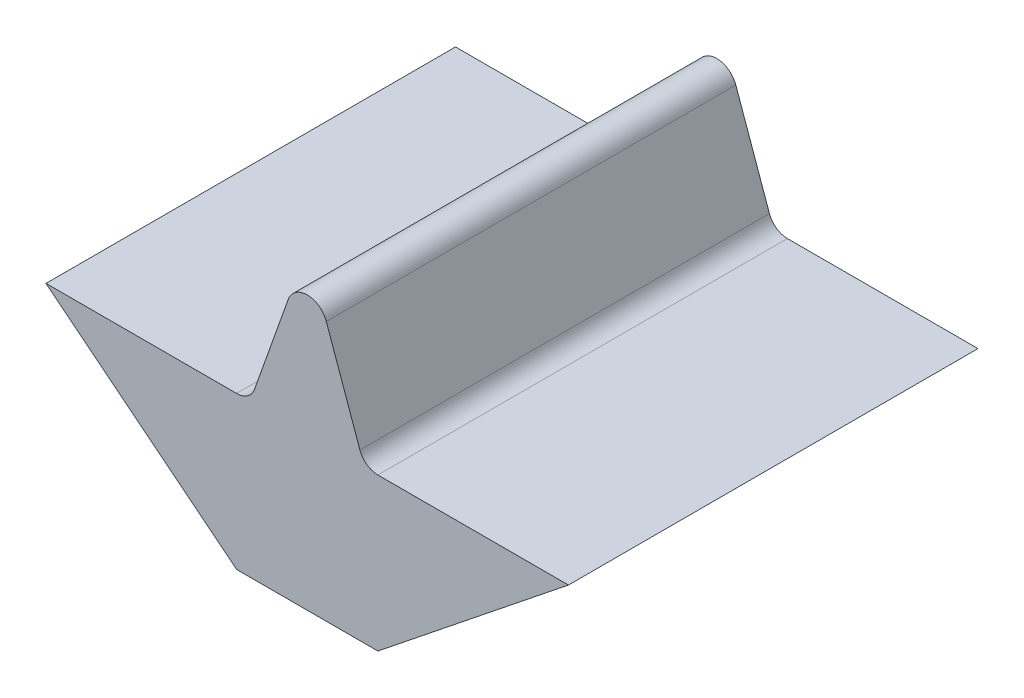
ISO-10303-21;
HEADER;
FILE_DESCRIPTION(('STEP AP214'),'2;1');
FILE_NAME('part.step','',(''),(''),'','','');
FILE_SCHEMA(('AUTOMOTIVE_DESIGN { 1 0 10303 214 1 1 1 1 }'));
ENDSEC;
DATA;
#1=APPLICATION_CONTEXT('core data for automotive mechanical design processes');
#2=APPLICATION_PROTOCOL_DEFINITION('international standard','automotive_design',2000,#1);
#3=PRODUCT_CONTEXT('',#1,'mechanical');
#4=PRODUCT('Part','Part','',(#3));
#5=PRODUCT_RELATED_PRODUCT_CATEGORY('part','',(#4));
#6=PRODUCT_DEFINITION_FORMATION('','',#4);
#7=PRODUCT_DEFINITION_CONTEXT('part definition',#1,'design');
#8=PRODUCT_DEFINITION('design','',#6,#7);
#9=PRODUCT_DEFINITION_SHAPE('','',#8);
#10=(LENGTH_UNIT() NAMED_UNIT(*) SI_UNIT(.MILLI.,.METRE.));
#11=(NAMED_UNIT(*) PLANE_ANGLE_UNIT() SI_UNIT($,.RADIAN.));
#12=(NAMED_UNIT(*) SI_UNIT($,.STERADIAN.) SOLID_ANGLE_UNIT());
#13=UNCERTAINTY_MEASURE_WITH_UNIT(LENGTH_MEASURE(1.E-05),#10,'distance_accuracy_value','');
#14=(GEOMETRIC_REPRESENTATION_CONTEXT(3) GLOBAL_UNCERTAINTY_ASSIGNED_CONTEXT((#13)) GLOBAL_UNIT_ASSIGNED_CONTEXT((#10,
#11,#12)) REPRESENTATION_CONTEXT('',''));
#15=CARTESIAN_POINT('',(0.,0.,0.));
#16=DIRECTION('',(0.,0.,1.));
#17=DIRECTION('',(1.,0.,0.));
#18=AXIS2_PLACEMENT_3D('',#15,#16,#17);
#19=CARTESIAN_POINT('',(-269.284845728883,142.112072029166,107.424));
#20=DIRECTION('',(0.624695047554424,0.78086880944303,0.));
#21=DIRECTION('',(-0.78086880944303,0.624695047554424,0.));
#22=AXIS2_PLACEMENT_3D('',#19,#20,#21);
#23=PLANE('',#22);
#24=DIRECTION('',(0.78086880944303,-0.624695047554424,0.));
#25=VECTOR('',#24,1.);
#26=CARTESIAN_POINT('',(-269.284845728883,142.112072029166,0.));
#27=LINE('',#26,#25);
#28=CARTESIAN_POINT('',(-269.284845728883,142.112072029166,0.));
#29=VERTEX_POINT('',#28);
#30=CARTESIAN_POINT('',(-219.284845728883,102.112072029166,0.));
#31=VERTEX_POINT('',#30);
#32=EDGE_CURVE('E142',#29,#31,#27,.T.);
#33=ORIENTED_EDGE('',*,*,#32,.T.);
#34=DIRECTION('',(0.,0.,-1.));
#35=VECTOR('',#34,1.);
#36=CARTESIAN_POINT('',(-219.284845728883,102.112072029166,107.424));
#37=LINE('',#36,#35);
#38=CARTESIAN_POINT('',(-219.284845728883,102.112072029166,107.424));
#39=VERTEX_POINT('',#38);
#40=EDGE_CURVE('E11',#39,#31,#37,.T.);
#41=ORIENTED_EDGE('',*,*,#40,.F.);
#42=DIRECTION('',(0.78086880944303,-0.624695047554424,0.));
#43=VECTOR('',#42,1.);
#44=CARTESIAN_POINT('',(-269.284845728883,142.112072029166,107.424));
#45=LINE('',#44,#43);
#46=CARTESIAN_POINT('',(-269.284845728883,142.112072029166,107.424));
#47=VERTEX_POINT('',#46);
#48=EDGE_CURVE('E160',#47,#39,#45,.T.);
#49=ORIENTED_EDGE('',*,*,#48,.F.);
#50=DIRECTION('',(0.,0.,-1.));
#51=VECTOR('',#50,1.);
#52=CARTESIAN_POINT('',(-269.284845728883,142.112072029166,107.424));
#53=LINE('',#52,#51);
#54=EDGE_CURVE('E138',#47,#29,#53,.T.);
#55=ORIENTED_EDGE('',*,*,#54,.T.);
#56=EDGE_LOOP('',(#33,#41,#49,#55));
#57=FACE_BOUND('',#56,.T.);
#58=ADVANCED_FACE('F34',(#57),#23,.F.);
#59=CARTESIAN_POINT('',(-219.284845728883,102.112072029166,107.424));
#60=DIRECTION('',(0.,1.,0.));
#61=DIRECTION('',(0.,0.,1.));
#62=AXIS2_PLACEMENT_3D('',#59,#60,#61);
#63=PLANE('',#62);
#64=DIRECTION('',(1.,0.,0.));
#65=VECTOR('',#64,1.);
#66=CARTESIAN_POINT('',(-219.284845728883,102.112072029166,0.));
#67=LINE('',#66,#65);
#68=CARTESIAN_POINT('',(-182.2279638816,102.112072029166,0.));
#69=VERTEX_POINT('',#68);
#70=EDGE_CURVE('E145',#31,#69,#67,.T.);
#71=ORIENTED_EDGE('',*,*,#70,.T.);
#72=DIRECTION('',(0.,0.,-1.));
#73=VECTOR('',#72,1.);
#74=CARTESIAN_POINT('',(-182.2279638816,102.112072029166,107.424));
#75=LINE('',#74,#73);
#76=CARTESIAN_POINT('',(-182.2279638816,102.112072029166,107.424));
#77=VERTEX_POINT('',#76);
#78=EDGE_CURVE('E42',#77,#69,#75,.T.);
#79=ORIENTED_EDGE('',*,*,#78,.F.);
#80=DIRECTION('',(1.,0.,0.));
#81=VECTOR('',#80,1.);
#82=CARTESIAN_POINT('',(-219.284845728883,102.112072029166,107.424));
#83=LINE('',#82,#81);
#84=EDGE_CURVE('E99',#39,#77,#83,.T.);
#85=ORIENTED_EDGE('',*,*,#84,.F.);
#86=ORIENTED_EDGE('',*,*,#40,.T.);
#87=EDGE_LOOP('',(#71,#79,#85,#86));
#88=FACE_BOUND('',#87,.T.);
#89=ADVANCED_FACE('F209',(#88),#63,.F.);
#90=CARTESIAN_POINT('',(-182.2279638816,102.112072029166,107.424));
#91=DIRECTION('',(-0.624695047554424,0.78086880944303,0.));
#92=DIRECTION('',(-0.78086880944303,-0.624695047554424,0.));
#93=AXIS2_PLACEMENT_3D('',#90,#91,#92);
#94=PLANE('',#93);
#95=DIRECTION('',(0.78086880944303,0.624695047554424,0.));
#96=VECTOR('',#95,1.);
#97=CARTESIAN_POINT('',(-182.2279638816,102.112072029166,0.));
#98=LINE('',#97,#96);
#99=CARTESIAN_POINT('',(-132.2279638816,142.112072029166,0.));
#100=VERTEX_POINT('',#99);
#101=EDGE_CURVE('E147',#69,#100,#98,.T.);
#102=ORIENTED_EDGE('',*,*,#101,.T.);
#103=DIRECTION('',(0.,0.,-1.));
#104=VECTOR('',#103,1.);
#105=CARTESIAN_POINT('',(-132.2279638816,142.112072029166,107.424));
#106=LINE('',#105,#104);
#107=CARTESIAN_POINT('',(-132.2279638816,142.112072029166,107.424));
#108=VERTEX_POINT('',#107);
#109=EDGE_CURVE('E173',#108,#100,#106,.T.);
#110=ORIENTED_EDGE('',*,*,#109,.F.);
#111=DIRECTION('',(0.78086880944303,0.624695047554424,0.));
#112=VECTOR('',#111,1.);
#113=CARTESIAN_POINT('',(-182.2279638816,102.112072029166,107.424));
#114=LINE('',#113,#112);
#115=EDGE_CURVE('E181',#77,#108,#114,.T.);
#116=ORIENTED_EDGE('',*,*,#115,.F.);
#117=ORIENTED_EDGE('',*,*,#78,.T.);
#118=EDGE_LOOP('',(#102,#110,#116,#117));
#119=FACE_BOUND('',#118,.T.);
#120=ADVANCED_FACE('F179',(#119),#94,.F.);
#121=CARTESIAN_POINT('',(-182.2279638816,142.112072029166,107.424));
#122=DIRECTION('',(0.,-1.,0.));
#123=DIRECTION('',(0.,0.,-1.));
#124=AXIS2_PLACEMENT_3D('',#121,#122,#123);
#125=PLANE('',#124);
#126=DIRECTION('',(-1.,0.,0.));
#127=VECTOR('',#126,1.);
#128=CARTESIAN_POINT('',(-182.2279638816,142.112072029166,0.));
#129=LINE('',#128,#127);
#130=CARTESIAN_POINT('',(-182.2279638816,142.112072029166,0.));
#131=VERTEX_POINT('',#130);
#132=EDGE_CURVE('E149',#100,#131,#129,.T.);
#133=ORIENTED_EDGE('',*,*,#132,.T.);
#134=DIRECTION('',(0.,0.,-1.));
#135=VECTOR('',#134,1.);
#136=CARTESIAN_POINT('',(-182.2279638816,142.112072029166,107.424));
#137=LINE('',#136,#135);
#138=CARTESIAN_POINT('',(-182.2279638816,142.112072029166,107.424));
#139=VERTEX_POINT('',#138);
#140=EDGE_CURVE('E170',#139,#131,#137,.T.);
#141=ORIENTED_EDGE('',*,*,#140,.F.);
#142=DIRECTION('',(-1.,0.,0.));
#143=VECTOR('',#142,1.);
#144=CARTESIAN_POINT('',(-182.2279638816,142.112072029166,107.424));
#145=LINE('',#144,#143);
#146=EDGE_CURVE('E199',#108,#139,#145,.T.);
#147=ORIENTED_EDGE('',*,*,#146,.F.);
#148=ORIENTED_EDGE('',*,*,#109,.T.);
#149=EDGE_LOOP('',(#133,#141,#147,#148));
#150=FACE_BOUND('',#149,.T.);
#151=ADVANCED_FACE('F190',(#150),#125,.F.);
#152=CARTESIAN_POINT('',(-182.2279638816,147.112072029166,107.424));
#153=DIRECTION('',(0.,0.,-1.));
#154=DIRECTION('',(-1.,0.,0.));
#155=AXIS2_PLACEMENT_3D('',#152,#153,#154);
#156=CYLINDRICAL_SURFACE('',#155,5.00000000000001);
#157=CARTESIAN_POINT('',(-182.2279638816,147.112072029166,0.));
#158=DIRECTION('',(0.,0.,-1.));
#159=DIRECTION('',(1.,0.,0.));
#160=AXIS2_PLACEMENT_3D('',#157,#158,#159);
#161=CIRCLE('',#160,5.00000000000001);
#162=CARTESIAN_POINT('',(-186.938846102381,145.436485952018,0.));
#163=VERTEX_POINT('',#162);
#164=EDGE_CURVE('E151',#131,#163,#161,.T.);
#165=ORIENTED_EDGE('',*,*,#164,.T.);
#166=DIRECTION('',(0.,0.,-1.));
#167=VECTOR('',#166,1.);
#168=CARTESIAN_POINT('',(-186.938846102381,145.436485952018,107.424));
#169=LINE('',#168,#167);
#170=CARTESIAN_POINT('',(-186.938846102381,145.436485952018,107.424));
#171=VERTEX_POINT('',#170);
#172=EDGE_CURVE('E167',#171,#163,#169,.T.);
#173=ORIENTED_EDGE('',*,*,#172,.F.);
#174=CARTESIAN_POINT('',(-182.2279638816,147.112072029166,107.424));
#175=DIRECTION('',(0.,0.,-1.));
#176=DIRECTION('',(1.,0.,0.));
#177=AXIS2_PLACEMENT_3D('',#174,#175,#176);
#178=CIRCLE('',#177,5.00000000000001);
#179=EDGE_CURVE('E196',#139,#171,#178,.T.);
#180=ORIENTED_EDGE('',*,*,#179,.F.);
#181=ORIENTED_EDGE('',*,*,#140,.T.);
#182=EDGE_LOOP('',(#165,#173,#180,#181));
#183=FACE_BOUND('',#182,.T.);
#184=ADVANCED_FACE('F194',(#183),#156,.F.);
#185=CARTESIAN_POINT('',(-195.756404805242,170.226904713842,107.424));
#186=DIRECTION('',(-0.942176444156101,-0.335117215429715,0.));
#187=DIRECTION('',(0.335117215429715,-0.942176444156101,0.));
#188=AXIS2_PLACEMENT_3D('',#185,#186,#187);
#189=PLANE('',#188);
#190=DIRECTION('',(-0.335117215429715,0.942176444156101,0.));
#191=VECTOR('',#190,1.);
#192=CARTESIAN_POINT('',(-195.756404805242,170.226904713842,0.));
#193=LINE('',#192,#191);
#194=CARTESIAN_POINT('',(-195.756404805242,170.226904713842,0.));
#195=VERTEX_POINT('',#194);
#196=EDGE_CURVE('E153',#163,#195,#193,.T.);
#197=ORIENTED_EDGE('',*,*,#196,.T.);
#198=DIRECTION('',(0.,0.,-1.));
#199=VECTOR('',#198,1.);
#200=CARTESIAN_POINT('',(-195.756404805242,170.226904713842,107.424));
#201=LINE('',#200,#199);
#202=CARTESIAN_POINT('',(-195.756404805242,170.226904713842,107.424));
#203=VERTEX_POINT('',#202);
#204=EDGE_CURVE('E164',#203,#195,#201,.T.);
#205=ORIENTED_EDGE('',*,*,#204,.F.);
#206=DIRECTION('',(-0.335117215429715,0.942176444156101,0.));
#207=VECTOR('',#206,1.);
#208=CARTESIAN_POINT('',(-195.756404805242,170.226904713842,107.424));
#209=LINE('',#208,#207);
#210=EDGE_CURVE('E198',#171,#203,#209,.T.);
#211=ORIENTED_EDGE('',*,*,#210,.F.);
#212=ORIENTED_EDGE('',*,*,#172,.T.);
#213=EDGE_LOOP('',(#197,#205,#211,#212));
#214=FACE_BOUND('',#213,.T.);
#215=ADVANCED_FACE('F221',(#214),#189,.F.);
#216=CARTESIAN_POINT('',(-200.756404805242,168.448484028904,107.424));
#217=DIRECTION('',(0.,0.,-1.));
#218=DIRECTION('',(-1.,0.,0.));
#219=AXIS2_PLACEMENT_3D('',#216,#217,#218);
#220=CYLINDRICAL_SURFACE('',#219,5.30686160857955);
#221=CARTESIAN_POINT('',(-200.756404805242,168.448484028904,0.));
#222=DIRECTION('',(0.,0.,1.));
#223=DIRECTION('',(-1.,0.,0.));
#224=AXIS2_PLACEMENT_3D('',#221,#222,#223);
#225=CIRCLE('',#224,5.30686160857955);
#226=CARTESIAN_POINT('',(-205.756404805242,170.226904713842,0.));
#227=VERTEX_POINT('',#226);
#228=EDGE_CURVE('E155',#195,#227,#225,.T.);
#229=ORIENTED_EDGE('',*,*,#228,.T.);
#230=DIRECTION('',(0.,0.,-1.));
#231=VECTOR('',#230,1.);
#232=CARTESIAN_POINT('',(-205.756404805242,170.226904713842,107.424));
#233=LINE('',#232,#231);
#234=CARTESIAN_POINT('',(-205.756404805242,170.226904713842,107.424));
#235=VERTEX_POINT('',#234);
#236=EDGE_CURVE('E133',#235,#227,#233,.T.);
#237=ORIENTED_EDGE('',*,*,#236,.F.);
#238=CARTESIAN_POINT('',(-200.756404805242,168.448484028904,107.424));
#239=DIRECTION('',(0.,0.,1.));
#240=DIRECTION('',(-1.,0.,0.));
#241=AXIS2_PLACEMENT_3D('',#238,#239,#240);
#242=CIRCLE('',#241,5.30686160857955);
#243=EDGE_CURVE('E124',#203,#235,#242,.T.);
#244=ORIENTED_EDGE('',*,*,#243,.F.);
#245=ORIENTED_EDGE('',*,*,#204,.T.);
#246=EDGE_LOOP('',(#229,#237,#244,#245));
#247=FACE_BOUND('',#246,.T.);
#248=ADVANCED_FACE('F224',(#247),#220,.T.);
#249=CARTESIAN_POINT('',(-214.573963508103,145.436485952018,107.424));
#250=DIRECTION('',(0.942176444156101,-0.335117215429715,0.));
#251=DIRECTION('',(0.335117215429715,0.942176444156101,0.));
#252=AXIS2_PLACEMENT_3D('',#249,#250,#251);
#253=PLANE('',#252);
#254=DIRECTION('',(-0.335117215429715,-0.942176444156101,0.));
#255=VECTOR('',#254,1.);
#256=CARTESIAN_POINT('',(-214.573963508103,145.436485952018,0.));
#257=LINE('',#256,#255);
#258=CARTESIAN_POINT('',(-214.573963508103,145.436485952018,0.));
#259=VERTEX_POINT('',#258);
#260=EDGE_CURVE('E132',#227,#259,#257,.T.);
#261=ORIENTED_EDGE('',*,*,#260,.T.);
#262=DIRECTION('',(0.,0.,-1.));
#263=VECTOR('',#262,1.);
#264=CARTESIAN_POINT('',(-214.573963508103,145.436485952018,107.424));
#265=LINE('',#264,#263);
#266=CARTESIAN_POINT('',(-214.573963508103,145.436485952018,107.424));
#267=VERTEX_POINT('',#266);
#268=EDGE_CURVE('E129',#267,#259,#265,.T.);
#269=ORIENTED_EDGE('',*,*,#268,.F.);
#270=DIRECTION('',(-0.335117215429715,-0.942176444156101,0.));
#271=VECTOR('',#270,1.);
#272=CARTESIAN_POINT('',(-214.573963508103,145.436485952018,107.424));
#273=LINE('',#272,#271);
#274=EDGE_CURVE('E118',#235,#267,#273,.T.);
#275=ORIENTED_EDGE('',*,*,#274,.F.);
#276=ORIENTED_EDGE('',*,*,#236,.T.);
#277=EDGE_LOOP('',(#261,#269,#275,#276));
#278=FACE_BOUND('',#277,.T.);
#279=ADVANCED_FACE('F130',(#278),#253,.F.);
#280=CARTESIAN_POINT('',(-219.284845728883,147.112072029166,107.424));
#281=DIRECTION('',(0.,0.,-1.));
#282=DIRECTION('',(-1.,0.,0.));
#283=AXIS2_PLACEMENT_3D('',#280,#281,#282);
#284=CYLINDRICAL_SURFACE('',#283,5.00000000000001);
#285=CARTESIAN_POINT('',(-219.284845728883,147.112072029166,0.));
#286=DIRECTION('',(0.,0.,-1.));
#287=DIRECTION('',(-1.,0.,0.));
#288=AXIS2_PLACEMENT_3D('',#285,#286,#287);
#289=CIRCLE('',#288,5.00000000000001);
#290=CARTESIAN_POINT('',(-219.284845728883,142.112072029166,0.));
#291=VERTEX_POINT('',#290);
#292=EDGE_CURVE('E85',#259,#291,#289,.T.);
#293=ORIENTED_EDGE('',*,*,#292,.T.);
#294=DIRECTION('',(0.,0.,-1.));
#295=VECTOR('',#294,1.);
#296=CARTESIAN_POINT('',(-219.284845728883,142.112072029166,107.424));
#297=LINE('',#296,#295);
#298=CARTESIAN_POINT('',(-219.284845728883,142.112072029166,107.424));
#299=VERTEX_POINT('',#298);
#300=EDGE_CURVE('E134',#299,#291,#297,.T.);
#301=ORIENTED_EDGE('',*,*,#300,.F.);
#302=CARTESIAN_POINT('',(-219.284845728883,147.112072029166,107.424));
#303=DIRECTION('',(0.,0.,-1.));
#304=DIRECTION('',(-1.,0.,0.));
#305=AXIS2_PLACEMENT_3D('',#302,#303,#304);
#306=CIRCLE('',#305,5.00000000000001);
#307=EDGE_CURVE('E122',#267,#299,#306,.T.);
#308=ORIENTED_EDGE('',*,*,#307,.F.);
#309=ORIENTED_EDGE('',*,*,#268,.T.);
#310=EDGE_LOOP('',(#293,#301,#308,#309));
#311=FACE_BOUND('',#310,.T.);
#312=ADVANCED_FACE('F136',(#311),#284,.F.);
#313=CARTESIAN_POINT('',(-269.284845728883,142.112072029166,107.424));
#314=DIRECTION('',(0.,-1.,0.));
#315=DIRECTION('',(0.,0.,-1.));
#316=AXIS2_PLACEMENT_3D('',#313,#314,#315);
#317=PLANE('',#316);
#318=DIRECTION('',(-1.,0.,0.));
#319=VECTOR('',#318,1.);
#320=CARTESIAN_POINT('',(-269.284845728883,142.112072029166,0.));
#321=LINE('',#320,#319);
#322=EDGE_CURVE('E91',#291,#29,#321,.T.);
#323=ORIENTED_EDGE('',*,*,#322,.T.);
#324=ORIENTED_EDGE('',*,*,#54,.F.);
#325=DIRECTION('',(-1.,0.,0.));
#326=VECTOR('',#325,1.);
#327=CARTESIAN_POINT('',(-269.284845728883,142.112072029166,107.424));
#328=LINE('',#327,#326);
#329=EDGE_CURVE('E50',#299,#47,#328,.T.);
#330=ORIENTED_EDGE('',*,*,#329,.F.);
#331=ORIENTED_EDGE('',*,*,#300,.T.);
#332=EDGE_LOOP('',(#323,#324,#330,#331));
#333=FACE_BOUND('',#332,.T.);
#334=ADVANCED_FACE('F233',(#333),#317,.F.);
#335=CARTESIAN_POINT('',(-182.2279638816,147.112072029166,107.424));
#336=DIRECTION('',(0.,0.,1.));
#337=DIRECTION('',(1.,0.,0.));
#338=AXIS2_PLACEMENT_3D('',#335,#336,#337);
#339=PLANE('',#338);
#340=ORIENTED_EDGE('',*,*,#48,.T.);
#341=ORIENTED_EDGE('',*,*,#84,.T.);
#342=ORIENTED_EDGE('',*,*,#115,.T.);
#343=ORIENTED_EDGE('',*,*,#146,.T.);
#344=ORIENTED_EDGE('',*,*,#179,.T.);
#345=ORIENTED_EDGE('',*,*,#210,.T.);
#346=ORIENTED_EDGE('',*,*,#243,.T.);
#347=ORIENTED_EDGE('',*,*,#274,.T.);
#348=ORIENTED_EDGE('',*,*,#307,.T.);
#349=ORIENTED_EDGE('',*,*,#329,.T.);
#350=EDGE_LOOP('',(#340,#341,#342,#343,#344,#345,#346,#347,#348,#349));
#351=FACE_BOUND('',#350,.T.);
#352=ADVANCED_FACE('F120',(#351),#339,.T.);
#353=CARTESIAN_POINT('',(-182.2279638816,147.112072029166,0.));
#354=DIRECTION('',(0.,0.,1.));
#355=DIRECTION('',(1.,0.,0.));
#356=AXIS2_PLACEMENT_3D('',#353,#354,#355);
#357=PLANE('',#356);
#358=ORIENTED_EDGE('',*,*,#32,.F.);
#359=ORIENTED_EDGE('',*,*,#322,.F.);
#360=ORIENTED_EDGE('',*,*,#292,.F.);
#361=ORIENTED_EDGE('',*,*,#260,.F.);
#362=ORIENTED_EDGE('',*,*,#228,.F.);
#363=ORIENTED_EDGE('',*,*,#196,.F.);
#364=ORIENTED_EDGE('',*,*,#164,.F.);
#365=ORIENTED_EDGE('',*,*,#132,.F.);
#366=ORIENTED_EDGE('',*,*,#101,.F.);
#367=ORIENTED_EDGE('',*,*,#70,.F.);
#368=EDGE_LOOP('',(#358,#359,#360,#361,#362,#363,#364,#365,#366,#367));
#369=FACE_BOUND('',#368,.T.);
#370=ADVANCED_FACE('F185',(#369),#357,.F.);
#371=CLOSED_SHELL('',(#58,#89,#120,#151,#184,#215,#248,#279,#312,#334,#352,#370));
#372=MANIFOLD_SOLID_BREP('B2',#371);
#373=ADVANCED_BREP_SHAPE_REPRESENTATION('',(#18,#372),#14);
#374=SHAPE_DEFINITION_REPRESENTATION(#9,#373);
ENDSEC;
END-ISO-10303-21;
